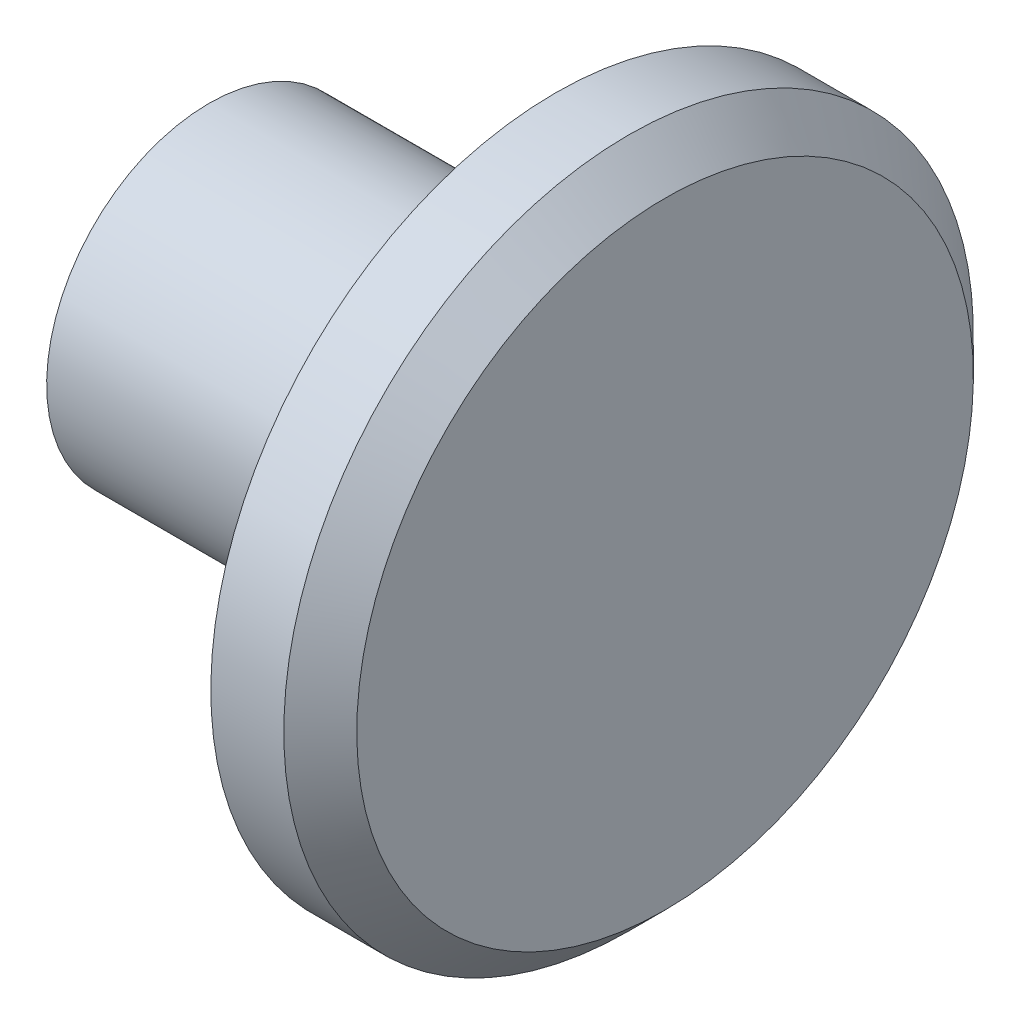
ISO-10303-21;
HEADER;
FILE_DESCRIPTION(('STEP AP214'),'2;1');
FILE_NAME('part.step','',(''),(''),'','','');
FILE_SCHEMA(('AUTOMOTIVE_DESIGN { 1 0 10303 214 1 1 1 1 }'));
ENDSEC;
DATA;
#1=APPLICATION_CONTEXT('core data for automotive mechanical design processes');
#2=APPLICATION_PROTOCOL_DEFINITION('international standard','automotive_design',2000,#1);
#3=PRODUCT_CONTEXT('',#1,'mechanical');
#4=PRODUCT('Part','Part','',(#3));
#5=PRODUCT_RELATED_PRODUCT_CATEGORY('part','',(#4));
#6=PRODUCT_DEFINITION_FORMATION('','',#4);
#7=PRODUCT_DEFINITION_CONTEXT('part definition',#1,'design');
#8=PRODUCT_DEFINITION('design','',#6,#7);
#9=PRODUCT_DEFINITION_SHAPE('','',#8);
#10=(LENGTH_UNIT() NAMED_UNIT(*) SI_UNIT(.MILLI.,.METRE.));
#11=(NAMED_UNIT(*) PLANE_ANGLE_UNIT() SI_UNIT($,.RADIAN.));
#12=(NAMED_UNIT(*) SI_UNIT($,.STERADIAN.) SOLID_ANGLE_UNIT());
#13=UNCERTAINTY_MEASURE_WITH_UNIT(LENGTH_MEASURE(1.E-05),#10,'distance_accuracy_value','');
#14=(GEOMETRIC_REPRESENTATION_CONTEXT(3) GLOBAL_UNCERTAINTY_ASSIGNED_CONTEXT((#13)) GLOBAL_UNIT_ASSIGNED_CONTEXT((#10,
#11,#12)) REPRESENTATION_CONTEXT('',''));
#15=CARTESIAN_POINT('',(0.,0.,0.));
#16=DIRECTION('',(0.,0.,1.));
#17=DIRECTION('',(1.,0.,0.));
#18=AXIS2_PLACEMENT_3D('',#15,#16,#17);
#19=CARTESIAN_POINT('',(6.25,0.,0.));
#20=DIRECTION('',(1.,0.,0.));
#21=DIRECTION('',(0.,1.,0.));
#22=AXIS2_PLACEMENT_3D('',#19,#20,#21);
#23=CYLINDRICAL_SURFACE('',#22,9.45);
#24=CARTESIAN_POINT('',(5.25,0.,0.));
#25=DIRECTION('',(-1.,0.,0.));
#26=DIRECTION('',(0.,-1.,0.));
#27=AXIS2_PLACEMENT_3D('',#24,#25,#26);
#28=CIRCLE('',#27,9.45);
#29=CARTESIAN_POINT('',(5.25,-9.45,0.));
#30=VERTEX_POINT('',#29);
#31=EDGE_CURVE('E10',#30,#30,#28,.T.);
#32=ORIENTED_EDGE('',*,*,#31,.T.);
#33=EDGE_LOOP('',(#32));
#34=FACE_BOUND('',#33,.T.);
#35=CARTESIAN_POINT('',(3.25,0.,0.));
#36=DIRECTION('',(1.,0.,0.));
#37=DIRECTION('',(0.,1.,0.));
#38=AXIS2_PLACEMENT_3D('',#35,#36,#37);
#39=CIRCLE('',#38,9.45);
#40=CARTESIAN_POINT('',(3.25,9.45,0.));
#41=VERTEX_POINT('',#40);
#42=EDGE_CURVE('E68',#41,#41,#39,.T.);
#43=ORIENTED_EDGE('',*,*,#42,.T.);
#44=EDGE_LOOP('',(#43));
#45=FACE_BOUND('',#44,.T.);
#46=ADVANCED_FACE('F42',(#34,#45),#23,.T.);
#47=CARTESIAN_POINT('',(6.25,-9.45,0.));
#48=DIRECTION('',(-1.,0.,0.));
#49=DIRECTION('',(0.,-1.,0.));
#50=AXIS2_PLACEMENT_3D('',#47,#48,#49);
#51=PLANE('',#50);
#52=CARTESIAN_POINT('',(6.25,0.,0.));
#53=DIRECTION('',(-1.,0.,0.));
#54=DIRECTION('',(0.,-1.,0.));
#55=AXIS2_PLACEMENT_3D('',#52,#53,#54);
#56=CIRCLE('',#55,8.45);
#57=CARTESIAN_POINT('',(6.25,-8.45,0.));
#58=VERTEX_POINT('',#57);
#59=EDGE_CURVE('E51',#58,#58,#56,.F.);
#60=ORIENTED_EDGE('',*,*,#59,.T.);
#61=EDGE_LOOP('',(#60));
#62=FACE_BOUND('',#61,.T.);
#63=ADVANCED_FACE('F87',(#62),#51,.F.);
#64=CARTESIAN_POINT('',(-6.25,-4.45,0.));
#65=DIRECTION('',(1.,0.,0.));
#66=DIRECTION('',(0.,1.,0.));
#67=AXIS2_PLACEMENT_3D('',#64,#65,#66);
#68=PLANE('',#67);
#69=CARTESIAN_POINT('',(-6.25,0.,0.));
#70=DIRECTION('',(1.,0.,0.));
#71=DIRECTION('',(0.,1.,0.));
#72=AXIS2_PLACEMENT_3D('',#69,#70,#71);
#73=CIRCLE('',#72,4.45);
#74=CARTESIAN_POINT('',(-6.25,4.45,0.));
#75=VERTEX_POINT('',#74);
#76=EDGE_CURVE('E57',#75,#75,#73,.T.);
#77=ORIENTED_EDGE('',*,*,#76,.F.);
#78=EDGE_LOOP('',(#77));
#79=FACE_BOUND('',#78,.T.);
#80=ADVANCED_FACE('F82',(#79),#68,.F.);
#81=CARTESIAN_POINT('',(6.25,0.,0.));
#82=DIRECTION('',(1.,0.,0.));
#83=DIRECTION('',(0.,1.,0.));
#84=AXIS2_PLACEMENT_3D('',#81,#82,#83);
#85=CYLINDRICAL_SURFACE('',#84,4.45);
#86=CARTESIAN_POINT('',(3.25,0.,0.));
#87=DIRECTION('',(1.,0.,0.));
#88=DIRECTION('',(0.,1.,0.));
#89=AXIS2_PLACEMENT_3D('',#86,#87,#88);
#90=CIRCLE('',#89,4.45);
#91=CARTESIAN_POINT('',(3.25,4.45,0.));
#92=VERTEX_POINT('',#91);
#93=EDGE_CURVE('E63',#92,#92,#90,.T.);
#94=ORIENTED_EDGE('',*,*,#93,.F.);
#95=EDGE_LOOP('',(#94));
#96=FACE_BOUND('',#95,.T.);
#97=ORIENTED_EDGE('',*,*,#76,.T.);
#98=EDGE_LOOP('',(#97));
#99=FACE_BOUND('',#98,.T.);
#100=ADVANCED_FACE('F76',(#96,#99),#85,.T.);
#101=CARTESIAN_POINT('',(3.25,-4.45,0.));
#102=DIRECTION('',(1.,0.,0.));
#103=DIRECTION('',(0.,1.,0.));
#104=AXIS2_PLACEMENT_3D('',#101,#102,#103);
#105=PLANE('',#104);
#106=ORIENTED_EDGE('',*,*,#42,.F.);
#107=EDGE_LOOP('',(#106));
#108=FACE_BOUND('',#107,.T.);
#109=ORIENTED_EDGE('',*,*,#93,.T.);
#110=EDGE_LOOP('',(#109));
#111=FACE_BOUND('',#110,.T.);
#112=ADVANCED_FACE('F73',(#108,#111),#105,.F.);
#113=CARTESIAN_POINT('',(6.25,0.,0.));
#114=DIRECTION('',(-1.,0.,0.));
#115=DIRECTION('',(0.,-1.,0.));
#116=AXIS2_PLACEMENT_3D('',#113,#114,#115);
#117=CONICAL_SURFACE('',#116,8.45,0.785398163397446);
#118=ORIENTED_EDGE('',*,*,#31,.F.);
#119=EDGE_LOOP('',(#118));
#120=FACE_BOUND('',#119,.T.);
#121=ORIENTED_EDGE('',*,*,#59,.F.);
#122=EDGE_LOOP('',(#121));
#123=FACE_BOUND('',#122,.T.);
#124=ADVANCED_FACE('F45',(#120,#123),#117,.T.);
#125=CLOSED_SHELL('',(#46,#63,#80,#100,#112,#124));
#126=MANIFOLD_SOLID_BREP('B2',#125);
#127=ADVANCED_BREP_SHAPE_REPRESENTATION('',(#18,#126),#14);
#128=SHAPE_DEFINITION_REPRESENTATION(#9,#127);
ENDSEC;
END-ISO-10303-21;
